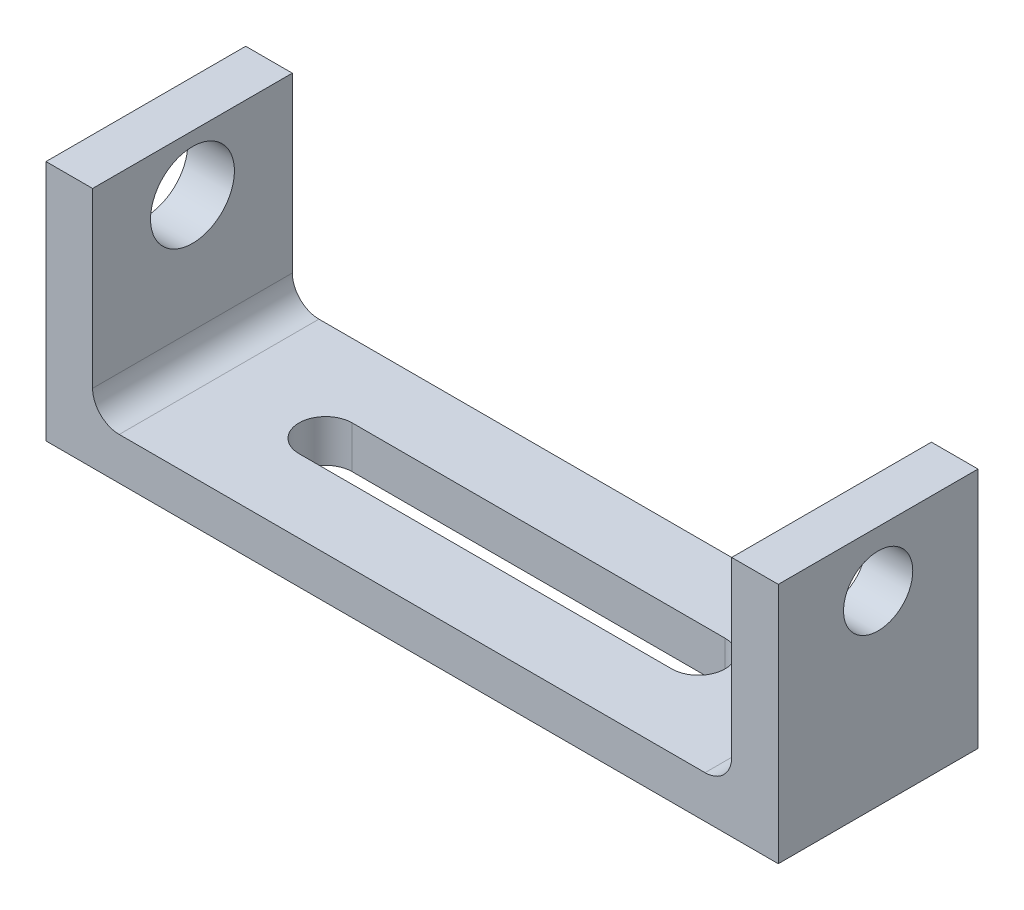
ISO-10303-21;
HEADER;
FILE_DESCRIPTION(('STEP AP214'),'2;1');
FILE_NAME('part.step','',(''),(''),'','','');
FILE_SCHEMA(('AUTOMOTIVE_DESIGN { 1 0 10303 214 1 1 1 1 }'));
ENDSEC;
DATA;
#1=APPLICATION_CONTEXT('core data for automotive mechanical design processes');
#2=APPLICATION_PROTOCOL_DEFINITION('international standard','automotive_design',2000,#1);
#3=PRODUCT_CONTEXT('',#1,'mechanical');
#4=PRODUCT('Part','Part','',(#3));
#5=PRODUCT_RELATED_PRODUCT_CATEGORY('part','',(#4));
#6=PRODUCT_DEFINITION_FORMATION('','',#4);
#7=PRODUCT_DEFINITION_CONTEXT('part definition',#1,'design');
#8=PRODUCT_DEFINITION('design','',#6,#7);
#9=PRODUCT_DEFINITION_SHAPE('','',#8);
#10=(LENGTH_UNIT() NAMED_UNIT(*) SI_UNIT(.MILLI.,.METRE.));
#11=(NAMED_UNIT(*) PLANE_ANGLE_UNIT() SI_UNIT($,.RADIAN.));
#12=(NAMED_UNIT(*) SI_UNIT($,.STERADIAN.) SOLID_ANGLE_UNIT());
#13=UNCERTAINTY_MEASURE_WITH_UNIT(LENGTH_MEASURE(1.E-05),#10,'distance_accuracy_value','');
#14=(GEOMETRIC_REPRESENTATION_CONTEXT(3) GLOBAL_UNCERTAINTY_ASSIGNED_CONTEXT((#13)) GLOBAL_UNIT_ASSIGNED_CONTEXT((#10,
#11,#12)) REPRESENTATION_CONTEXT('',''));
#15=CARTESIAN_POINT('',(0.,0.,0.));
#16=DIRECTION('',(0.,0.,1.));
#17=DIRECTION('',(1.,0.,0.));
#18=AXIS2_PLACEMENT_3D('',#15,#16,#17);
#19=CARTESIAN_POINT('',(0.,3.175,0.));
#20=DIRECTION('',(0.,-1.,0.));
#21=DIRECTION('',(0.,0.,-1.));
#22=AXIS2_PLACEMENT_3D('',#19,#20,#21);
#23=PLANE('',#22);
#24=DIRECTION('',(1.,0.,0.));
#25=VECTOR('',#24,1.);
#26=CARTESIAN_POINT('',(-14.,3.175,2.));
#27=LINE('',#26,#25);
#28=CARTESIAN_POINT('',(-14.,3.175,2.));
#29=VERTEX_POINT('',#28);
#30=CARTESIAN_POINT('',(14.,3.175,2.));
#31=VERTEX_POINT('',#30);
#32=EDGE_CURVE('E164',#29,#31,#27,.T.);
#33=ORIENTED_EDGE('',*,*,#32,.F.);
#34=CARTESIAN_POINT('',(-14.,3.175,0.));
#35=DIRECTION('',(0.,1.,0.));
#36=DIRECTION('',(0.,0.,1.));
#37=AXIS2_PLACEMENT_3D('',#34,#35,#36);
#38=CIRCLE('',#37,2.);
#39=CARTESIAN_POINT('',(-14.,3.175,-2.));
#40=VERTEX_POINT('',#39);
#41=EDGE_CURVE('E49',#40,#29,#38,.T.);
#42=ORIENTED_EDGE('',*,*,#41,.F.);
#43=DIRECTION('',(-1.,0.,0.));
#44=VECTOR('',#43,1.);
#45=CARTESIAN_POINT('',(-14.,3.175,-2.));
#46=LINE('',#45,#44);
#47=CARTESIAN_POINT('',(14.,3.175,-2.));
#48=VERTEX_POINT('',#47);
#49=EDGE_CURVE('E152',#48,#40,#46,.T.);
#50=ORIENTED_EDGE('',*,*,#49,.F.);
#51=CARTESIAN_POINT('',(14.,3.175,0.));
#52=DIRECTION('',(0.,1.,0.));
#53=DIRECTION('',(0.,0.,1.));
#54=AXIS2_PLACEMENT_3D('',#51,#52,#53);
#55=CIRCLE('',#54,2.);
#56=EDGE_CURVE('E155',#31,#48,#55,.T.);
#57=ORIENTED_EDGE('',*,*,#56,.F.);
#58=EDGE_LOOP('',(#33,#42,#50,#57));
#59=FACE_BOUND('',#58,.T.);
#60=DIRECTION('',(1.,0.,0.));
#61=VECTOR('',#60,1.);
#62=CARTESIAN_POINT('',(-27.5,3.175,7.5));
#63=LINE('',#62,#61);
#64=CARTESIAN_POINT('',(-22.,3.175,7.5));
#65=VERTEX_POINT('',#64);
#66=CARTESIAN_POINT('',(22.,3.175,7.5));
#67=VERTEX_POINT('',#66);
#68=EDGE_CURVE('E210',#65,#67,#63,.T.);
#69=ORIENTED_EDGE('',*,*,#68,.T.);
#70=DIRECTION('',(0.,0.,1.));
#71=VECTOR('',#70,1.);
#72=CARTESIAN_POINT('',(22.,3.175,-7.5));
#73=LINE('',#72,#71);
#74=CARTESIAN_POINT('',(22.,3.175,-7.5));
#75=VERTEX_POINT('',#74);
#76=EDGE_CURVE('E238',#67,#75,#73,.F.);
#77=ORIENTED_EDGE('',*,*,#76,.T.);
#78=DIRECTION('',(-1.,0.,0.));
#79=VECTOR('',#78,1.);
#80=CARTESIAN_POINT('',(-27.5,3.175,-7.5));
#81=LINE('',#80,#79);
#82=CARTESIAN_POINT('',(-22.,3.175,-7.5));
#83=VERTEX_POINT('',#82);
#84=EDGE_CURVE('E207',#75,#83,#81,.T.);
#85=ORIENTED_EDGE('',*,*,#84,.T.);
#86=DIRECTION('',(0.,0.,-1.));
#87=VECTOR('',#86,1.);
#88=CARTESIAN_POINT('',(-22.,3.175,7.5));
#89=LINE('',#88,#87);
#90=EDGE_CURVE('E236',#83,#65,#89,.F.);
#91=ORIENTED_EDGE('',*,*,#90,.T.);
#92=EDGE_LOOP('',(#69,#77,#85,#91));
#93=FACE_BOUND('',#92,.T.);
#94=ADVANCED_FACE('F32',(#59,#93),#23,.F.);
#95=CARTESIAN_POINT('',(27.5,3.175,7.5));
#96=DIRECTION('',(-1.,0.,0.));
#97=DIRECTION('',(0.,0.,1.));
#98=AXIS2_PLACEMENT_3D('',#95,#96,#97);
#99=PLANE('',#98);
#100=CARTESIAN_POINT('',(27.5,14.,0.));
#101=DIRECTION('',(1.,0.,0.));
#102=DIRECTION('',(0.,0.,-1.));
#103=AXIS2_PLACEMENT_3D('',#100,#101,#102);
#104=CIRCLE('',#103,2.6);
#105=CARTESIAN_POINT('',(27.5,14.,-2.6));
#106=VERTEX_POINT('',#105);
#107=EDGE_CURVE('E158',#106,#106,#104,.T.);
#108=ORIENTED_EDGE('',*,*,#107,.F.);
#109=EDGE_LOOP('',(#108));
#110=FACE_BOUND('',#109,.T.);
#111=DIRECTION('',(0.,0.,-1.));
#112=VECTOR('',#111,1.);
#113=CARTESIAN_POINT('',(27.5,0.,7.5));
#114=LINE('',#113,#112);
#115=CARTESIAN_POINT('',(27.5,0.,7.5));
#116=VERTEX_POINT('',#115);
#117=CARTESIAN_POINT('',(27.5,0.,-7.5));
#118=VERTEX_POINT('',#117);
#119=EDGE_CURVE('E206',#116,#118,#114,.T.);
#120=ORIENTED_EDGE('',*,*,#119,.T.);
#121=DIRECTION('',(0.,-1.,0.));
#122=VECTOR('',#121,1.);
#123=CARTESIAN_POINT('',(27.5,3.175,-7.5));
#124=LINE('',#123,#122);
#125=CARTESIAN_POINT('',(27.5,18.175,-7.50000000000001));
#126=VERTEX_POINT('',#125);
#127=EDGE_CURVE('E230',#126,#118,#124,.T.);
#128=ORIENTED_EDGE('',*,*,#127,.F.);
#129=DIRECTION('',(0.,0.,-1.));
#130=VECTOR('',#129,1.);
#131=CARTESIAN_POINT('',(27.5,18.175,-7.50000000000001));
#132=LINE('',#131,#130);
#133=CARTESIAN_POINT('',(27.5,18.175,7.50000000000001));
#134=VERTEX_POINT('',#133);
#135=EDGE_CURVE('E171',#134,#126,#132,.T.);
#136=ORIENTED_EDGE('',*,*,#135,.F.);
#137=DIRECTION('',(0.,-1.,0.));
#138=VECTOR('',#137,1.);
#139=CARTESIAN_POINT('',(27.5,3.175,7.5));
#140=LINE('',#139,#138);
#141=EDGE_CURVE('E214',#134,#116,#140,.T.);
#142=ORIENTED_EDGE('',*,*,#141,.T.);
#143=EDGE_LOOP('',(#120,#128,#136,#142));
#144=FACE_BOUND('',#143,.T.);
#145=ADVANCED_FACE('F277',(#110,#144),#99,.F.);
#146=CARTESIAN_POINT('',(-27.5,3.175,-7.5));
#147=DIRECTION('',(0.,0.,1.));
#148=DIRECTION('',(1.,0.,0.));
#149=AXIS2_PLACEMENT_3D('',#146,#147,#148);
#150=PLANE('',#149);
#151=DIRECTION('',(-1.,0.,0.));
#152=VECTOR('',#151,1.);
#153=CARTESIAN_POINT('',(-27.5,0.,-7.5));
#154=LINE('',#153,#152);
#155=CARTESIAN_POINT('',(-27.5,0.,-7.5));
#156=VERTEX_POINT('',#155);
#157=EDGE_CURVE('E217',#118,#156,#154,.T.);
#158=ORIENTED_EDGE('',*,*,#157,.T.);
#159=DIRECTION('',(0.,-1.,0.));
#160=VECTOR('',#159,1.);
#161=CARTESIAN_POINT('',(-27.5,3.175,-7.5));
#162=LINE('',#161,#160);
#163=CARTESIAN_POINT('',(-27.5,18.175,-7.5));
#164=VERTEX_POINT('',#163);
#165=EDGE_CURVE('E227',#164,#156,#162,.T.);
#166=ORIENTED_EDGE('',*,*,#165,.F.);
#167=DIRECTION('',(-1.,0.,0.));
#168=VECTOR('',#167,1.);
#169=CARTESIAN_POINT('',(-27.5,18.175,-7.5));
#170=LINE('',#169,#168);
#171=CARTESIAN_POINT('',(-24.,18.175,-7.5));
#172=VERTEX_POINT('',#171);
#173=EDGE_CURVE('E197',#172,#164,#170,.T.);
#174=ORIENTED_EDGE('',*,*,#173,.F.);
#175=DIRECTION('',(0.,-1.,0.));
#176=VECTOR('',#175,1.);
#177=CARTESIAN_POINT('',(-24.,18.175,-7.5));
#178=LINE('',#177,#176);
#179=CARTESIAN_POINT('',(-24.,5.175,-7.5));
#180=VERTEX_POINT('',#179);
#181=EDGE_CURVE('E200',#172,#180,#178,.T.);
#182=ORIENTED_EDGE('',*,*,#181,.T.);
#183=CARTESIAN_POINT('',(-22.,5.175,-7.5));
#184=DIRECTION('',(0.,0.,1.));
#185=DIRECTION('',(1.,0.,0.));
#186=AXIS2_PLACEMENT_3D('',#183,#184,#185);
#187=CIRCLE('',#186,2.);
#188=EDGE_CURVE('E41',#180,#83,#187,.T.);
#189=ORIENTED_EDGE('',*,*,#188,.T.);
#190=ORIENTED_EDGE('',*,*,#84,.F.);
#191=CARTESIAN_POINT('',(22.,5.175,-7.5));
#192=DIRECTION('',(0.,0.,1.));
#193=DIRECTION('',(1.,0.,0.));
#194=AXIS2_PLACEMENT_3D('',#191,#192,#193);
#195=CIRCLE('',#194,2.);
#196=CARTESIAN_POINT('',(24.,5.175,-7.50000000000001));
#197=VERTEX_POINT('',#196);
#198=EDGE_CURVE('E245',#75,#197,#195,.T.);
#199=ORIENTED_EDGE('',*,*,#198,.T.);
#200=DIRECTION('',(0.,-1.,0.));
#201=VECTOR('',#200,1.);
#202=CARTESIAN_POINT('',(24.,18.175,-7.50000000000001));
#203=LINE('',#202,#201);
#204=CARTESIAN_POINT('',(24.,18.175,-7.50000000000001));
#205=VERTEX_POINT('',#204);
#206=EDGE_CURVE('E187',#205,#197,#203,.T.);
#207=ORIENTED_EDGE('',*,*,#206,.F.);
#208=DIRECTION('',(-1.,0.,0.));
#209=VECTOR('',#208,1.);
#210=CARTESIAN_POINT('',(27.5,18.175,-7.50000000000001));
#211=LINE('',#210,#209);
#212=EDGE_CURVE('E177',#126,#205,#211,.T.);
#213=ORIENTED_EDGE('',*,*,#212,.F.);
#214=ORIENTED_EDGE('',*,*,#127,.T.);
#215=EDGE_LOOP('',(#158,#166,#174,#182,#189,#190,#199,#207,#213,#214));
#216=FACE_BOUND('',#215,.T.);
#217=ADVANCED_FACE('F267',(#216),#150,.F.);
#218=CARTESIAN_POINT('',(-27.5,3.175,7.5));
#219=DIRECTION('',(1.,0.,0.));
#220=DIRECTION('',(0.,0.,-1.));
#221=AXIS2_PLACEMENT_3D('',#218,#219,#220);
#222=PLANE('',#221);
#223=CARTESIAN_POINT('',(-27.5,14.,-2.06362704702201E-11));
#224=DIRECTION('',(-1.,0.,0.));
#225=DIRECTION('',(0.,0.,1.));
#226=AXIS2_PLACEMENT_3D('',#223,#224,#225);
#227=CIRCLE('',#226,3.15000000001959);
#228=CARTESIAN_POINT('',(-27.5,14.,3.14999999999895));
#229=VERTEX_POINT('',#228);
#230=EDGE_CURVE('E254',#229,#229,#227,.T.);
#231=ORIENTED_EDGE('',*,*,#230,.F.);
#232=EDGE_LOOP('',(#231));
#233=FACE_BOUND('',#232,.T.);
#234=DIRECTION('',(0.,0.,1.));
#235=VECTOR('',#234,1.);
#236=CARTESIAN_POINT('',(-27.5,0.,7.5));
#237=LINE('',#236,#235);
#238=CARTESIAN_POINT('',(-27.5,0.,7.5));
#239=VERTEX_POINT('',#238);
#240=EDGE_CURVE('E219',#156,#239,#237,.T.);
#241=ORIENTED_EDGE('',*,*,#240,.T.);
#242=DIRECTION('',(0.,-1.,0.));
#243=VECTOR('',#242,1.);
#244=CARTESIAN_POINT('',(-27.5,3.175,7.5));
#245=LINE('',#244,#243);
#246=CARTESIAN_POINT('',(-27.5,18.175,7.5));
#247=VERTEX_POINT('',#246);
#248=EDGE_CURVE('E224',#247,#239,#245,.T.);
#249=ORIENTED_EDGE('',*,*,#248,.F.);
#250=DIRECTION('',(0.,0.,1.));
#251=VECTOR('',#250,1.);
#252=CARTESIAN_POINT('',(-27.5,18.175,-7.5));
#253=LINE('',#252,#251);
#254=EDGE_CURVE('E190',#164,#247,#253,.T.);
#255=ORIENTED_EDGE('',*,*,#254,.F.);
#256=ORIENTED_EDGE('',*,*,#165,.T.);
#257=EDGE_LOOP('',(#241,#249,#255,#256));
#258=FACE_BOUND('',#257,.T.);
#259=ADVANCED_FACE('F263',(#233,#258),#222,.F.);
#260=CARTESIAN_POINT('',(-27.5,3.175,7.5));
#261=DIRECTION('',(0.,0.,-1.));
#262=DIRECTION('',(-1.,0.,0.));
#263=AXIS2_PLACEMENT_3D('',#260,#261,#262);
#264=PLANE('',#263);
#265=DIRECTION('',(1.,0.,0.));
#266=VECTOR('',#265,1.);
#267=CARTESIAN_POINT('',(-27.5,0.,7.5));
#268=LINE('',#267,#266);
#269=EDGE_CURVE('E211',#239,#116,#268,.T.);
#270=ORIENTED_EDGE('',*,*,#269,.T.);
#271=ORIENTED_EDGE('',*,*,#141,.F.);
#272=DIRECTION('',(1.,0.,0.));
#273=VECTOR('',#272,1.);
#274=CARTESIAN_POINT('',(27.5,18.175,7.50000000000001));
#275=LINE('',#274,#273);
#276=CARTESIAN_POINT('',(24.,18.175,7.50000000000001));
#277=VERTEX_POINT('',#276);
#278=EDGE_CURVE('E181',#277,#134,#275,.T.);
#279=ORIENTED_EDGE('',*,*,#278,.F.);
#280=DIRECTION('',(0.,-1.,0.));
#281=VECTOR('',#280,1.);
#282=CARTESIAN_POINT('',(24.,18.175,7.50000000000001));
#283=LINE('',#282,#281);
#284=CARTESIAN_POINT('',(24.,5.175,7.50000000000001));
#285=VERTEX_POINT('',#284);
#286=EDGE_CURVE('E184',#277,#285,#283,.T.);
#287=ORIENTED_EDGE('',*,*,#286,.T.);
#288=CARTESIAN_POINT('',(22.,5.175,7.5));
#289=DIRECTION('',(0.,0.,-1.));
#290=DIRECTION('',(-1.,0.,0.));
#291=AXIS2_PLACEMENT_3D('',#288,#289,#290);
#292=CIRCLE('',#291,2.);
#293=EDGE_CURVE('E243',#285,#67,#292,.T.);
#294=ORIENTED_EDGE('',*,*,#293,.T.);
#295=ORIENTED_EDGE('',*,*,#68,.F.);
#296=CARTESIAN_POINT('',(-22.,5.175,7.5));
#297=DIRECTION('',(0.,0.,-1.));
#298=DIRECTION('',(-1.,0.,0.));
#299=AXIS2_PLACEMENT_3D('',#296,#297,#298);
#300=CIRCLE('',#299,2.);
#301=CARTESIAN_POINT('',(-24.,5.175,7.5));
#302=VERTEX_POINT('',#301);
#303=EDGE_CURVE('E11',#65,#302,#300,.T.);
#304=ORIENTED_EDGE('',*,*,#303,.T.);
#305=DIRECTION('',(0.,-1.,0.));
#306=VECTOR('',#305,1.);
#307=CARTESIAN_POINT('',(-24.,18.175,7.5));
#308=LINE('',#307,#306);
#309=CARTESIAN_POINT('',(-24.,18.175,7.5));
#310=VERTEX_POINT('',#309);
#311=EDGE_CURVE('E203',#310,#302,#308,.T.);
#312=ORIENTED_EDGE('',*,*,#311,.F.);
#313=DIRECTION('',(1.,0.,0.));
#314=VECTOR('',#313,1.);
#315=CARTESIAN_POINT('',(-27.5,18.175,7.5));
#316=LINE('',#315,#314);
#317=EDGE_CURVE('E193',#247,#310,#316,.T.);
#318=ORIENTED_EDGE('',*,*,#317,.F.);
#319=ORIENTED_EDGE('',*,*,#248,.T.);
#320=EDGE_LOOP('',(#270,#271,#279,#287,#294,#295,#304,#312,#318,#319));
#321=FACE_BOUND('',#320,.T.);
#322=ADVANCED_FACE('F266',(#321),#264,.F.);
#323=CARTESIAN_POINT('',(0.,0.,0.));
#324=DIRECTION('',(0.,-1.,0.));
#325=DIRECTION('',(0.,0.,-1.));
#326=AXIS2_PLACEMENT_3D('',#323,#324,#325);
#327=PLANE('',#326);
#328=CARTESIAN_POINT('',(-14.,0.,0.));
#329=DIRECTION('',(0.,1.,0.));
#330=DIRECTION('',(0.,0.,1.));
#331=AXIS2_PLACEMENT_3D('',#328,#329,#330);
#332=CIRCLE('',#331,2.);
#333=CARTESIAN_POINT('',(-14.,0.,-2.));
#334=VERTEX_POINT('',#333);
#335=CARTESIAN_POINT('',(-14.,0.,2.));
#336=VERTEX_POINT('',#335);
#337=EDGE_CURVE('E136',#334,#336,#332,.T.);
#338=ORIENTED_EDGE('',*,*,#337,.T.);
#339=DIRECTION('',(1.,0.,0.));
#340=VECTOR('',#339,1.);
#341=CARTESIAN_POINT('',(-14.,0.,2.));
#342=LINE('',#341,#340);
#343=CARTESIAN_POINT('',(14.,0.,2.));
#344=VERTEX_POINT('',#343);
#345=EDGE_CURVE('E145',#336,#344,#342,.T.);
#346=ORIENTED_EDGE('',*,*,#345,.T.);
#347=CARTESIAN_POINT('',(14.,0.,0.));
#348=DIRECTION('',(0.,1.,0.));
#349=DIRECTION('',(0.,0.,1.));
#350=AXIS2_PLACEMENT_3D('',#347,#348,#349);
#351=CIRCLE('',#350,2.);
#352=CARTESIAN_POINT('',(14.,0.,-2.));
#353=VERTEX_POINT('',#352);
#354=EDGE_CURVE('E57',#344,#353,#351,.T.);
#355=ORIENTED_EDGE('',*,*,#354,.T.);
#356=DIRECTION('',(-1.,0.,0.));
#357=VECTOR('',#356,1.);
#358=CARTESIAN_POINT('',(-14.,0.,-2.));
#359=LINE('',#358,#357);
#360=EDGE_CURVE('E142',#353,#334,#359,.T.);
#361=ORIENTED_EDGE('',*,*,#360,.T.);
#362=EDGE_LOOP('',(#338,#346,#355,#361));
#363=FACE_BOUND('',#362,.T.);
#364=ORIENTED_EDGE('',*,*,#119,.F.);
#365=ORIENTED_EDGE('',*,*,#269,.F.);
#366=ORIENTED_EDGE('',*,*,#240,.F.);
#367=ORIENTED_EDGE('',*,*,#157,.F.);
#368=EDGE_LOOP('',(#364,#365,#366,#367));
#369=FACE_BOUND('',#368,.T.);
#370=ADVANCED_FACE('F149',(#363,#369),#327,.T.);
#371=CARTESIAN_POINT('',(-24.,18.175,-7.5));
#372=DIRECTION('',(-1.,0.,0.));
#373=DIRECTION('',(0.,0.,1.));
#374=AXIS2_PLACEMENT_3D('',#371,#372,#373);
#375=PLANE('',#374);
#376=CARTESIAN_POINT('',(-24.,14.,-2.06362704702201E-11));
#377=DIRECTION('',(-1.,0.,0.));
#378=DIRECTION('',(0.,0.,1.));
#379=AXIS2_PLACEMENT_3D('',#376,#377,#378);
#380=CIRCLE('',#379,3.15000000001959);
#381=CARTESIAN_POINT('',(-24.,14.,3.14999999999895));
#382=VERTEX_POINT('',#381);
#383=EDGE_CURVE('E36',#382,#382,#380,.T.);
#384=ORIENTED_EDGE('',*,*,#383,.T.);
#385=EDGE_LOOP('',(#384));
#386=FACE_BOUND('',#385,.T.);
#387=ORIENTED_EDGE('',*,*,#311,.T.);
#388=DIRECTION('',(0.,0.,-1.));
#389=VECTOR('',#388,1.);
#390=CARTESIAN_POINT('',(-24.,5.175,-7.5));
#391=LINE('',#390,#389);
#392=EDGE_CURVE('E240',#302,#180,#391,.T.);
#393=ORIENTED_EDGE('',*,*,#392,.T.);
#394=ORIENTED_EDGE('',*,*,#181,.F.);
#395=DIRECTION('',(0.,0.,-1.));
#396=VECTOR('',#395,1.);
#397=CARTESIAN_POINT('',(-24.,18.175,-7.5));
#398=LINE('',#397,#396);
#399=EDGE_CURVE('E195',#310,#172,#398,.T.);
#400=ORIENTED_EDGE('',*,*,#399,.F.);
#401=EDGE_LOOP('',(#387,#393,#394,#400));
#402=FACE_BOUND('',#401,.T.);
#403=ADVANCED_FACE('F303',(#386,#402),#375,.F.);
#404=CARTESIAN_POINT('',(0.,18.175,0.));
#405=DIRECTION('',(0.,1.,0.));
#406=DIRECTION('',(0.,0.,1.));
#407=AXIS2_PLACEMENT_3D('',#404,#405,#406);
#408=PLANE('',#407);
#409=ORIENTED_EDGE('',*,*,#254,.T.);
#410=ORIENTED_EDGE('',*,*,#317,.T.);
#411=ORIENTED_EDGE('',*,*,#399,.T.);
#412=ORIENTED_EDGE('',*,*,#173,.T.);
#413=EDGE_LOOP('',(#409,#410,#411,#412));
#414=FACE_BOUND('',#413,.T.);
#415=ADVANCED_FACE('F307',(#414),#408,.T.);
#416=CARTESIAN_POINT('',(24.,18.175,-7.50000000000001));
#417=DIRECTION('',(1.,0.,0.));
#418=DIRECTION('',(0.,0.,-1.));
#419=AXIS2_PLACEMENT_3D('',#416,#417,#418);
#420=PLANE('',#419);
#421=CARTESIAN_POINT('',(24.,14.,0.));
#422=DIRECTION('',(1.,0.,0.));
#423=DIRECTION('',(0.,0.,-1.));
#424=AXIS2_PLACEMENT_3D('',#421,#422,#423);
#425=CIRCLE('',#424,2.6);
#426=CARTESIAN_POINT('',(24.,14.,-2.6));
#427=VERTEX_POINT('',#426);
#428=EDGE_CURVE('E165',#427,#427,#425,.T.);
#429=ORIENTED_EDGE('',*,*,#428,.T.);
#430=EDGE_LOOP('',(#429));
#431=FACE_BOUND('',#430,.T.);
#432=ORIENTED_EDGE('',*,*,#206,.T.);
#433=DIRECTION('',(0.,0.,1.));
#434=VECTOR('',#433,1.);
#435=CARTESIAN_POINT('',(24.,5.175,7.5));
#436=LINE('',#435,#434);
#437=EDGE_CURVE('E233',#197,#285,#436,.T.);
#438=ORIENTED_EDGE('',*,*,#437,.T.);
#439=ORIENTED_EDGE('',*,*,#286,.F.);
#440=DIRECTION('',(0.,0.,1.));
#441=VECTOR('',#440,1.);
#442=CARTESIAN_POINT('',(24.,18.175,-7.50000000000001));
#443=LINE('',#442,#441);
#444=EDGE_CURVE('E179',#205,#277,#443,.T.);
#445=ORIENTED_EDGE('',*,*,#444,.F.);
#446=EDGE_LOOP('',(#432,#438,#439,#445));
#447=FACE_BOUND('',#446,.T.);
#448=ADVANCED_FACE('F287',(#431,#447),#420,.F.);
#449=CARTESIAN_POINT('',(0.,18.175,0.));
#450=DIRECTION('',(0.,-1.,0.));
#451=DIRECTION('',(0.,0.,-1.));
#452=AXIS2_PLACEMENT_3D('',#449,#450,#451);
#453=PLANE('',#452);
#454=ORIENTED_EDGE('',*,*,#135,.T.);
#455=ORIENTED_EDGE('',*,*,#212,.T.);
#456=ORIENTED_EDGE('',*,*,#444,.T.);
#457=ORIENTED_EDGE('',*,*,#278,.T.);
#458=EDGE_LOOP('',(#454,#455,#456,#457));
#459=FACE_BOUND('',#458,.T.);
#460=ADVANCED_FACE('F282',(#459),#453,.F.);
#461=CARTESIAN_POINT('',(22.,5.175,-7.50000000000001));
#462=DIRECTION('',(0.,0.,-1.));
#463=DIRECTION('',(-1.,0.,0.));
#464=AXIS2_PLACEMENT_3D('',#461,#462,#463);
#465=CYLINDRICAL_SURFACE('',#464,2.);
#466=ORIENTED_EDGE('',*,*,#198,.F.);
#467=ORIENTED_EDGE('',*,*,#76,.F.);
#468=ORIENTED_EDGE('',*,*,#293,.F.);
#469=ORIENTED_EDGE('',*,*,#437,.F.);
#470=EDGE_LOOP('',(#466,#467,#468,#469));
#471=FACE_BOUND('',#470,.T.);
#472=ADVANCED_FACE('F297',(#471),#465,.F.);
#473=CARTESIAN_POINT('',(-22.,5.175,-7.5));
#474=DIRECTION('',(0.,0.,1.));
#475=DIRECTION('',(1.,0.,0.));
#476=AXIS2_PLACEMENT_3D('',#473,#474,#475);
#477=CYLINDRICAL_SURFACE('',#476,2.);
#478=ORIENTED_EDGE('',*,*,#303,.F.);
#479=ORIENTED_EDGE('',*,*,#90,.F.);
#480=ORIENTED_EDGE('',*,*,#188,.F.);
#481=ORIENTED_EDGE('',*,*,#392,.F.);
#482=EDGE_LOOP('',(#478,#479,#480,#481));
#483=FACE_BOUND('',#482,.T.);
#484=ADVANCED_FACE('F34',(#483),#477,.F.);
#485=CARTESIAN_POINT('',(-14.,0.,0.));
#486=DIRECTION('',(0.,1.,0.));
#487=DIRECTION('',(0.,0.,1.));
#488=AXIS2_PLACEMENT_3D('',#485,#486,#487);
#489=CYLINDRICAL_SURFACE('',#488,2.);
#490=ORIENTED_EDGE('',*,*,#41,.T.);
#491=DIRECTION('',(0.,1.,0.));
#492=VECTOR('',#491,1.);
#493=CARTESIAN_POINT('',(-14.,0.,2.));
#494=LINE('',#493,#492);
#495=EDGE_CURVE('E132',#336,#29,#494,.T.);
#496=ORIENTED_EDGE('',*,*,#495,.F.);
#497=ORIENTED_EDGE('',*,*,#337,.F.);
#498=DIRECTION('',(0.,1.,0.));
#499=VECTOR('',#498,1.);
#500=CARTESIAN_POINT('',(-14.,0.,-2.));
#501=LINE('',#500,#499);
#502=EDGE_CURVE('E169',#334,#40,#501,.T.);
#503=ORIENTED_EDGE('',*,*,#502,.T.);
#504=EDGE_LOOP('',(#490,#496,#497,#503));
#505=FACE_BOUND('',#504,.T.);
#506=ADVANCED_FACE('F134',(#505),#489,.F.);
#507=CARTESIAN_POINT('',(-14.,0.,-2.));
#508=DIRECTION('',(0.,0.,-1.));
#509=DIRECTION('',(-1.,0.,0.));
#510=AXIS2_PLACEMENT_3D('',#507,#508,#509);
#511=PLANE('',#510);
#512=ORIENTED_EDGE('',*,*,#49,.T.);
#513=ORIENTED_EDGE('',*,*,#502,.F.);
#514=ORIENTED_EDGE('',*,*,#360,.F.);
#515=DIRECTION('',(0.,1.,0.));
#516=VECTOR('',#515,1.);
#517=CARTESIAN_POINT('',(14.,0.,-2.));
#518=LINE('',#517,#516);
#519=EDGE_CURVE('E172',#353,#48,#518,.T.);
#520=ORIENTED_EDGE('',*,*,#519,.T.);
#521=EDGE_LOOP('',(#512,#513,#514,#520));
#522=FACE_BOUND('',#521,.T.);
#523=ADVANCED_FACE('F341',(#522),#511,.F.);
#524=CARTESIAN_POINT('',(14.,0.,0.));
#525=DIRECTION('',(0.,1.,0.));
#526=DIRECTION('',(0.,0.,1.));
#527=AXIS2_PLACEMENT_3D('',#524,#525,#526);
#528=CYLINDRICAL_SURFACE('',#527,2.);
#529=ORIENTED_EDGE('',*,*,#56,.T.);
#530=ORIENTED_EDGE('',*,*,#519,.F.);
#531=ORIENTED_EDGE('',*,*,#354,.F.);
#532=DIRECTION('',(0.,1.,0.));
#533=VECTOR('',#532,1.);
#534=CARTESIAN_POINT('',(14.,0.,2.));
#535=LINE('',#534,#533);
#536=EDGE_CURVE('E141',#344,#31,#535,.T.);
#537=ORIENTED_EDGE('',*,*,#536,.T.);
#538=EDGE_LOOP('',(#529,#530,#531,#537));
#539=FACE_BOUND('',#538,.T.);
#540=ADVANCED_FACE('F345',(#539),#528,.F.);
#541=CARTESIAN_POINT('',(-14.,0.,2.));
#542=DIRECTION('',(0.,0.,1.));
#543=DIRECTION('',(1.,0.,0.));
#544=AXIS2_PLACEMENT_3D('',#541,#542,#543);
#545=PLANE('',#544);
#546=ORIENTED_EDGE('',*,*,#32,.T.);
#547=ORIENTED_EDGE('',*,*,#536,.F.);
#548=ORIENTED_EDGE('',*,*,#345,.F.);
#549=ORIENTED_EDGE('',*,*,#495,.T.);
#550=EDGE_LOOP('',(#546,#547,#548,#549));
#551=FACE_BOUND('',#550,.T.);
#552=ADVANCED_FACE('F146',(#551),#545,.F.);
#553=CARTESIAN_POINT('',(17.5,14.,0.));
#554=DIRECTION('',(1.,0.,0.));
#555=DIRECTION('',(0.,0.,-1.));
#556=AXIS2_PLACEMENT_3D('',#553,#554,#555);
#557=CYLINDRICAL_SURFACE('',#556,2.6);
#558=ORIENTED_EDGE('',*,*,#107,.T.);
#559=EDGE_LOOP('',(#558));
#560=FACE_BOUND('',#559,.T.);
#561=ORIENTED_EDGE('',*,*,#428,.F.);
#562=EDGE_LOOP('',(#561));
#563=FACE_BOUND('',#562,.T.);
#564=ADVANCED_FACE('F344',(#560,#563),#557,.F.);
#565=CARTESIAN_POINT('',(-22.5,14.,-2.06362704702201E-11));
#566=DIRECTION('',(-1.,0.,0.));
#567=DIRECTION('',(0.,0.,1.));
#568=AXIS2_PLACEMENT_3D('',#565,#566,#567);
#569=CYLINDRICAL_SURFACE('',#568,3.15000000001959);
#570=ORIENTED_EDGE('',*,*,#230,.T.);
#571=EDGE_LOOP('',(#570));
#572=FACE_BOUND('',#571,.T.);
#573=ORIENTED_EDGE('',*,*,#383,.F.);
#574=EDGE_LOOP('',(#573));
#575=FACE_BOUND('',#574,.T.);
#576=ADVANCED_FACE('F260',(#572,#575),#569,.F.);
#577=CLOSED_SHELL('',(#94,#145,#217,#259,#322,#370,#403,#415,#448,#460,#472,#484,#506,#523,#540,
#552,#564,#576));
#578=MANIFOLD_SOLID_BREP('B2',#577);
#579=ADVANCED_BREP_SHAPE_REPRESENTATION('',(#18,#578),#14);
#580=SHAPE_DEFINITION_REPRESENTATION(#9,#579);
ENDSEC;
END-ISO-10303-21;
